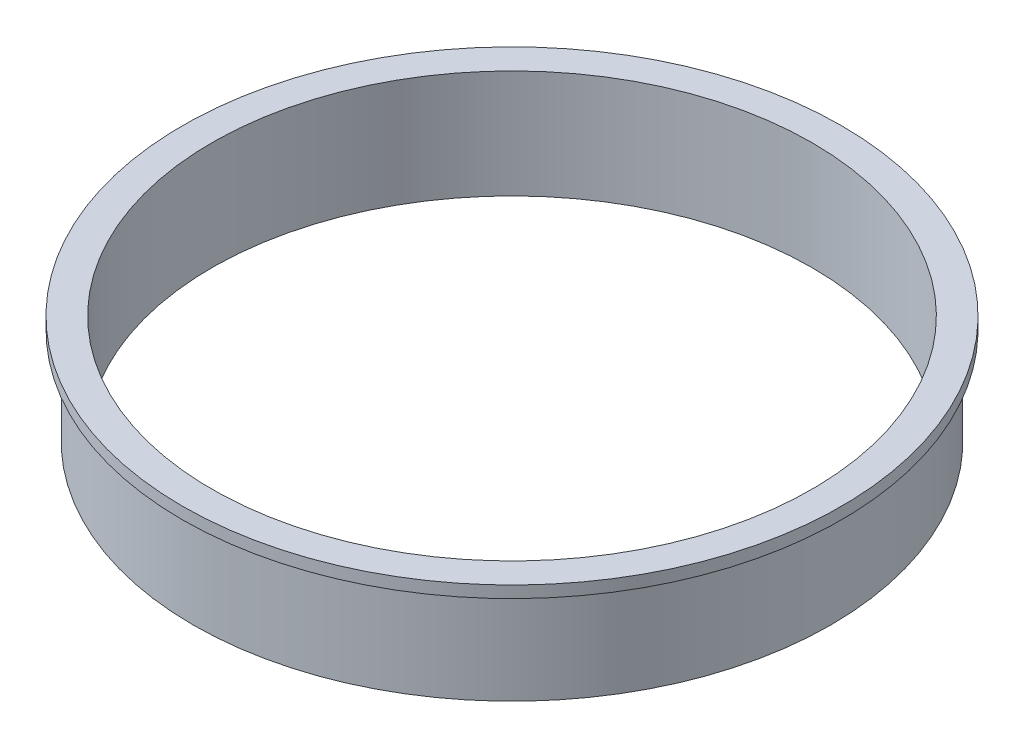
ISO-10303-21;
HEADER;
FILE_DESCRIPTION(('STEP AP214'),'2;1');
FILE_NAME('part.step','',(''),(''),'','','');
FILE_SCHEMA(('AUTOMOTIVE_DESIGN { 1 0 10303 214 1 1 1 1 }'));
ENDSEC;
DATA;
#1=APPLICATION_CONTEXT('core data for automotive mechanical design processes');
#2=APPLICATION_PROTOCOL_DEFINITION('international standard','automotive_design',2000,#1);
#3=PRODUCT_CONTEXT('',#1,'mechanical');
#4=PRODUCT('Part','Part','',(#3));
#5=PRODUCT_RELATED_PRODUCT_CATEGORY('part','',(#4));
#6=PRODUCT_DEFINITION_FORMATION('','',#4);
#7=PRODUCT_DEFINITION_CONTEXT('part definition',#1,'design');
#8=PRODUCT_DEFINITION('design','',#6,#7);
#9=PRODUCT_DEFINITION_SHAPE('','',#8);
#10=(LENGTH_UNIT() NAMED_UNIT(*) SI_UNIT(.MILLI.,.METRE.));
#11=(NAMED_UNIT(*) PLANE_ANGLE_UNIT() SI_UNIT($,.RADIAN.));
#12=(NAMED_UNIT(*) SI_UNIT($,.STERADIAN.) SOLID_ANGLE_UNIT());
#13=UNCERTAINTY_MEASURE_WITH_UNIT(LENGTH_MEASURE(1.E-05),#10,'distance_accuracy_value','');
#14=(GEOMETRIC_REPRESENTATION_CONTEXT(3) GLOBAL_UNCERTAINTY_ASSIGNED_CONTEXT((#13)) GLOBAL_UNIT_ASSIGNED_CONTEXT((#10,
#11,#12)) REPRESENTATION_CONTEXT('',''));
#15=CARTESIAN_POINT('',(0.,0.,0.));
#16=DIRECTION('',(0.,0.,1.));
#17=DIRECTION('',(1.,0.,0.));
#18=AXIS2_PLACEMENT_3D('',#15,#16,#17);
#19=CARTESIAN_POINT('',(0.,0.,0.));
#20=DIRECTION('',(0.,-1.,0.));
#21=DIRECTION('',(0.,0.,-1.));
#22=AXIS2_PLACEMENT_3D('',#19,#20,#21);
#23=CYLINDRICAL_SURFACE('',#22,14.875);
#24=CARTESIAN_POINT('',(0.,0.,0.));
#25=DIRECTION('',(0.,-1.,0.));
#26=DIRECTION('',(0.,0.,-1.));
#27=AXIS2_PLACEMENT_3D('',#24,#25,#26);
#28=CIRCLE('',#27,14.875);
#29=CARTESIAN_POINT('',(0.,0.,-14.875));
#30=VERTEX_POINT('',#29);
#31=EDGE_CURVE('E10',#30,#30,#28,.T.);
#32=ORIENTED_EDGE('',*,*,#31,.F.);
#33=EDGE_LOOP('',(#32));
#34=FACE_BOUND('',#33,.T.);
#35=CARTESIAN_POINT('',(0.,4.5,0.));
#36=DIRECTION('',(0.,-1.,0.));
#37=DIRECTION('',(0.,0.,-1.));
#38=AXIS2_PLACEMENT_3D('',#35,#36,#37);
#39=CIRCLE('',#38,14.875);
#40=CARTESIAN_POINT('',(0.,4.5,-14.875));
#41=VERTEX_POINT('',#40);
#42=EDGE_CURVE('E70',#41,#41,#39,.T.);
#43=ORIENTED_EDGE('',*,*,#42,.T.);
#44=EDGE_LOOP('',(#43));
#45=FACE_BOUND('',#44,.T.);
#46=ADVANCED_FACE('F43',(#34,#45),#23,.T.);
#47=CARTESIAN_POINT('',(0.,0.,14.875));
#48=DIRECTION('',(0.,1.,0.));
#49=DIRECTION('',(0.,0.,1.));
#50=AXIS2_PLACEMENT_3D('',#47,#48,#49);
#51=PLANE('',#50);
#52=CARTESIAN_POINT('',(0.,0.,0.));
#53=DIRECTION('',(0.,-1.,0.));
#54=DIRECTION('',(0.,0.,-1.));
#55=AXIS2_PLACEMENT_3D('',#52,#53,#54);
#56=CIRCLE('',#55,14.);
#57=CARTESIAN_POINT('',(0.,0.,-14.));
#58=VERTEX_POINT('',#57);
#59=EDGE_CURVE('E50',#58,#58,#56,.T.);
#60=ORIENTED_EDGE('',*,*,#59,.F.);
#61=EDGE_LOOP('',(#60));
#62=FACE_BOUND('',#61,.T.);
#63=ORIENTED_EDGE('',*,*,#31,.T.);
#64=EDGE_LOOP('',(#63));
#65=FACE_BOUND('',#64,.T.);
#66=ADVANCED_FACE('F96',(#62,#65),#51,.F.);
#67=CARTESIAN_POINT('',(0.,0.,0.));
#68=DIRECTION('',(0.,-1.,0.));
#69=DIRECTION('',(0.,0.,-1.));
#70=AXIS2_PLACEMENT_3D('',#67,#68,#69);
#71=CYLINDRICAL_SURFACE('',#70,14.);
#72=CARTESIAN_POINT('',(0.,5.05,0.));
#73=DIRECTION('',(0.,-1.,0.));
#74=DIRECTION('',(0.,0.,-1.));
#75=AXIS2_PLACEMENT_3D('',#72,#73,#74);
#76=CIRCLE('',#75,14.);
#77=CARTESIAN_POINT('',(0.,5.05,-14.));
#78=VERTEX_POINT('',#77);
#79=EDGE_CURVE('E55',#78,#78,#76,.T.);
#80=ORIENTED_EDGE('',*,*,#79,.F.);
#81=EDGE_LOOP('',(#80));
#82=FACE_BOUND('',#81,.T.);
#83=ORIENTED_EDGE('',*,*,#59,.T.);
#84=EDGE_LOOP('',(#83));
#85=FACE_BOUND('',#84,.T.);
#86=ADVANCED_FACE('F91',(#82,#85),#71,.F.);
#87=CARTESIAN_POINT('',(0.,5.05,14.));
#88=DIRECTION('',(0.,-1.,0.));
#89=DIRECTION('',(0.,0.,-1.));
#90=AXIS2_PLACEMENT_3D('',#87,#88,#89);
#91=PLANE('',#90);
#92=CARTESIAN_POINT('',(0.,5.05,0.));
#93=DIRECTION('',(0.,-1.,0.));
#94=DIRECTION('',(0.,0.,-1.));
#95=AXIS2_PLACEMENT_3D('',#92,#93,#94);
#96=CIRCLE('',#95,15.375);
#97=CARTESIAN_POINT('',(0.,5.05,-15.375));
#98=VERTEX_POINT('',#97);
#99=EDGE_CURVE('E60',#98,#98,#96,.T.);
#100=ORIENTED_EDGE('',*,*,#99,.F.);
#101=EDGE_LOOP('',(#100));
#102=FACE_BOUND('',#101,.T.);
#103=ORIENTED_EDGE('',*,*,#79,.T.);
#104=EDGE_LOOP('',(#103));
#105=FACE_BOUND('',#104,.T.);
#106=ADVANCED_FACE('F85',(#102,#105),#91,.F.);
#107=CARTESIAN_POINT('',(0.,0.,0.));
#108=DIRECTION('',(0.,-1.,0.));
#109=DIRECTION('',(0.,0.,-1.));
#110=AXIS2_PLACEMENT_3D('',#107,#108,#109);
#111=CYLINDRICAL_SURFACE('',#110,15.375);
#112=CARTESIAN_POINT('',(0.,4.5,0.));
#113=DIRECTION('',(0.,-1.,0.));
#114=DIRECTION('',(0.,0.,-1.));
#115=AXIS2_PLACEMENT_3D('',#112,#113,#114);
#116=CIRCLE('',#115,15.375);
#117=CARTESIAN_POINT('',(0.,4.5,-15.375));
#118=VERTEX_POINT('',#117);
#119=EDGE_CURVE('E66',#118,#118,#116,.T.);
#120=ORIENTED_EDGE('',*,*,#119,.F.);
#121=EDGE_LOOP('',(#120));
#122=FACE_BOUND('',#121,.T.);
#123=ORIENTED_EDGE('',*,*,#99,.T.);
#124=EDGE_LOOP('',(#123));
#125=FACE_BOUND('',#124,.T.);
#126=ADVANCED_FACE('F79',(#122,#125),#111,.T.);
#127=CARTESIAN_POINT('',(0.,4.5,15.375));
#128=DIRECTION('',(0.,1.,0.));
#129=DIRECTION('',(0.,0.,1.));
#130=AXIS2_PLACEMENT_3D('',#127,#128,#129);
#131=PLANE('',#130);
#132=ORIENTED_EDGE('',*,*,#42,.F.);
#133=EDGE_LOOP('',(#132));
#134=FACE_BOUND('',#133,.T.);
#135=ORIENTED_EDGE('',*,*,#119,.T.);
#136=EDGE_LOOP('',(#135));
#137=FACE_BOUND('',#136,.T.);
#138=ADVANCED_FACE('F76',(#134,#137),#131,.F.);
#139=CLOSED_SHELL('',(#46,#66,#86,#106,#126,#138));
#140=MANIFOLD_SOLID_BREP('B2',#139);
#141=ADVANCED_BREP_SHAPE_REPRESENTATION('',(#18,#140),#14);
#142=SHAPE_DEFINITION_REPRESENTATION(#9,#141);
ENDSEC;
END-ISO-10303-21;
